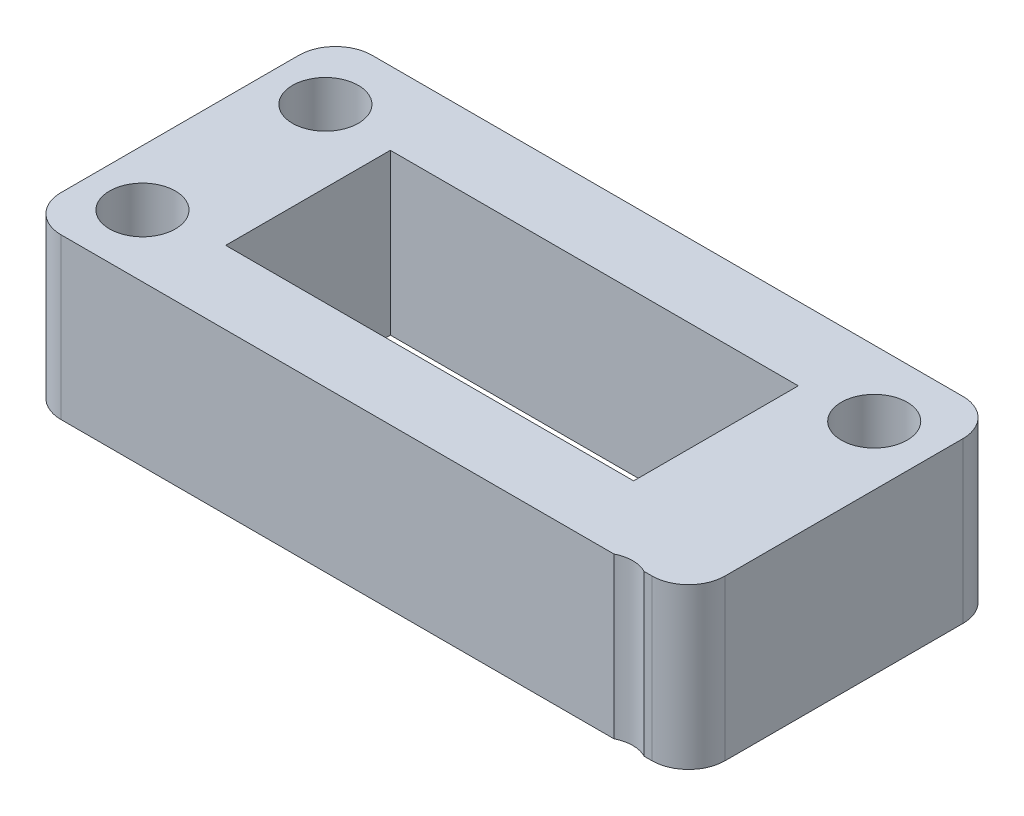
ISO-10303-21;
HEADER;
FILE_DESCRIPTION(('STEP AP214'),'2;1');
FILE_NAME('part.step','',(''),(''),'','','');
FILE_SCHEMA(('AUTOMOTIVE_DESIGN { 1 0 10303 214 1 1 1 1 }'));
ENDSEC;
DATA;
#1=APPLICATION_CONTEXT('core data for automotive mechanical design processes');
#2=APPLICATION_PROTOCOL_DEFINITION('international standard','automotive_design',2000,#1);
#3=PRODUCT_CONTEXT('',#1,'mechanical');
#4=PRODUCT('Part','Part','',(#3));
#5=PRODUCT_RELATED_PRODUCT_CATEGORY('part','',(#4));
#6=PRODUCT_DEFINITION_FORMATION('','',#4);
#7=PRODUCT_DEFINITION_CONTEXT('part definition',#1,'design');
#8=PRODUCT_DEFINITION('design','',#6,#7);
#9=PRODUCT_DEFINITION_SHAPE('','',#8);
#10=(LENGTH_UNIT() NAMED_UNIT(*) SI_UNIT(.MILLI.,.METRE.));
#11=(NAMED_UNIT(*) PLANE_ANGLE_UNIT() SI_UNIT($,.RADIAN.));
#12=(NAMED_UNIT(*) SI_UNIT($,.STERADIAN.) SOLID_ANGLE_UNIT());
#13=UNCERTAINTY_MEASURE_WITH_UNIT(LENGTH_MEASURE(1.E-05),#10,'distance_accuracy_value','');
#14=(GEOMETRIC_REPRESENTATION_CONTEXT(3) GLOBAL_UNCERTAINTY_ASSIGNED_CONTEXT((#13)) GLOBAL_UNIT_ASSIGNED_CONTEXT((#10,
#11,#12)) REPRESENTATION_CONTEXT('',''));
#15=CARTESIAN_POINT('',(0.,0.,0.));
#16=DIRECTION('',(0.,0.,1.));
#17=DIRECTION('',(1.,0.,0.));
#18=AXIS2_PLACEMENT_3D('',#15,#16,#17);
#19=CARTESIAN_POINT('',(0.,8.75,0.));
#20=DIRECTION('',(0.,0.,-1.));
#21=DIRECTION('',(-1.,0.,0.));
#22=AXIS2_PLACEMENT_3D('',#19,#20,#21);
#23=PLANE('',#22);
#24=DIRECTION('',(1.,0.,0.));
#25=VECTOR('',#24,1.);
#26=CARTESIAN_POINT('',(0.,8.75,0.));
#27=LINE('',#26,#25);
#28=CARTESIAN_POINT('',(2.,8.75,0.));
#29=VERTEX_POINT('',#28);
#30=CARTESIAN_POINT('',(32.2253838753308,8.75,0.));
#31=VERTEX_POINT('',#30);
#32=EDGE_CURVE('E220',#29,#31,#27,.T.);
#33=ORIENTED_EDGE('',*,*,#32,.F.);
#34=DIRECTION('',(0.,-1.,0.));
#35=VECTOR('',#34,1.);
#36=CARTESIAN_POINT('',(2.,8.75,0.));
#37=LINE('',#36,#35);
#38=CARTESIAN_POINT('',(2.,0.,0.));
#39=VERTEX_POINT('',#38);
#40=EDGE_CURVE('E11',#29,#39,#37,.T.);
#41=ORIENTED_EDGE('',*,*,#40,.T.);
#42=DIRECTION('',(1.,0.,0.));
#43=VECTOR('',#42,1.);
#44=CARTESIAN_POINT('',(0.,0.,0.));
#45=LINE('',#44,#43);
#46=CARTESIAN_POINT('',(32.2253838753308,0.,0.));
#47=VERTEX_POINT('',#46);
#48=EDGE_CURVE('E143',#39,#47,#45,.T.);
#49=ORIENTED_EDGE('',*,*,#48,.T.);
#50=DIRECTION('',(0.,1.,0.));
#51=VECTOR('',#50,1.);
#52=CARTESIAN_POINT('',(32.2253838753308,8.75,0.));
#53=LINE('',#52,#51);
#54=EDGE_CURVE('E145',#47,#31,#53,.T.);
#55=ORIENTED_EDGE('',*,*,#54,.T.);
#56=EDGE_LOOP('',(#33,#41,#49,#55));
#57=FACE_BOUND('',#56,.T.);
#58=ADVANCED_FACE('F39',(#57),#23,.F.);
#59=CARTESIAN_POINT('',(0.,8.75,0.));
#60=DIRECTION('',(0.,1.,0.));
#61=DIRECTION('',(0.,0.,1.));
#62=AXIS2_PLACEMENT_3D('',#59,#60,#61);
#63=PLANE('',#62);
#64=CARTESIAN_POINT('',(3.05000500045595,8.75,-3.39999999999836));
#65=DIRECTION('',(0.,1.,0.));
#66=DIRECTION('',(0.,0.,1.));
#67=AXIS2_PLACEMENT_3D('',#64,#65,#66);
#68=CIRCLE('',#67,1.79999999999999);
#69=CARTESIAN_POINT('',(3.05000500045595,8.75,-1.59999999999837));
#70=VERTEX_POINT('',#69);
#71=EDGE_CURVE('E480',#70,#70,#68,.T.);
#72=ORIENTED_EDGE('',*,*,#71,.F.);
#73=EDGE_LOOP('',(#72));
#74=FACE_BOUND('',#73,.T.);
#75=DIRECTION('',(-1.,0.,0.));
#76=VECTOR('',#75,1.);
#77=CARTESIAN_POINT('',(36.3,8.75,-17.));
#78=LINE('',#77,#76);
#79=CARTESIAN_POINT('',(34.3,8.75,-17.));
#80=VERTEX_POINT('',#79);
#81=CARTESIAN_POINT('',(2.,8.75,-17.));
#82=VERTEX_POINT('',#81);
#83=EDGE_CURVE('E224',#80,#82,#78,.T.);
#84=ORIENTED_EDGE('',*,*,#83,.T.);
#85=CARTESIAN_POINT('',(2.,8.75,-15.));
#86=DIRECTION('',(0.,1.,0.));
#87=DIRECTION('',(0.,0.,1.));
#88=AXIS2_PLACEMENT_3D('',#85,#86,#87);
#89=CIRCLE('',#88,2.);
#90=CARTESIAN_POINT('',(0.,8.75,-15.));
#91=VERTEX_POINT('',#90);
#92=EDGE_CURVE('E255',#82,#91,#89,.T.);
#93=ORIENTED_EDGE('',*,*,#92,.T.);
#94=DIRECTION('',(0.,0.,1.));
#95=VECTOR('',#94,1.);
#96=CARTESIAN_POINT('',(0.,8.75,-17.));
#97=LINE('',#96,#95);
#98=CARTESIAN_POINT('',(0.,8.75,-2.));
#99=VERTEX_POINT('',#98);
#100=EDGE_CURVE('E216',#91,#99,#97,.T.);
#101=ORIENTED_EDGE('',*,*,#100,.T.);
#102=CARTESIAN_POINT('',(2.,8.75,-2.));
#103=DIRECTION('',(0.,1.,0.));
#104=DIRECTION('',(0.,0.,1.));
#105=AXIS2_PLACEMENT_3D('',#102,#103,#104);
#106=CIRCLE('',#105,2.);
#107=EDGE_CURVE('E54',#99,#29,#106,.T.);
#108=ORIENTED_EDGE('',*,*,#107,.T.);
#109=ORIENTED_EDGE('',*,*,#32,.T.);
#110=CARTESIAN_POINT('',(33.0500050004553,8.75,1.59999999999948));
#111=DIRECTION('',(0.,1.,0.));
#112=DIRECTION('',(0.,0.,1.));
#113=AXIS2_PLACEMENT_3D('',#110,#111,#112);
#114=CIRCLE('',#113,1.79999999999999);
#115=CARTESIAN_POINT('',(33.8746261255798,8.75,0.));
#116=VERTEX_POINT('',#115);
#117=EDGE_CURVE('E158',#116,#31,#114,.T.);
#118=ORIENTED_EDGE('',*,*,#117,.F.);
#119=CARTESIAN_POINT('',(34.3,8.75,0.));
#120=VERTEX_POINT('',#119);
#121=EDGE_CURVE('E218',#116,#120,#27,.T.);
#122=ORIENTED_EDGE('',*,*,#121,.T.);
#123=CARTESIAN_POINT('',(34.3,8.75,-2.));
#124=DIRECTION('',(0.,1.,0.));
#125=DIRECTION('',(0.,0.,1.));
#126=AXIS2_PLACEMENT_3D('',#123,#124,#125);
#127=CIRCLE('',#126,2.);
#128=CARTESIAN_POINT('',(36.3,8.75,-2.));
#129=VERTEX_POINT('',#128);
#130=EDGE_CURVE('E251',#120,#129,#127,.T.);
#131=ORIENTED_EDGE('',*,*,#130,.T.);
#132=DIRECTION('',(0.,0.,-1.));
#133=VECTOR('',#132,1.);
#134=CARTESIAN_POINT('',(36.3,8.75,0.));
#135=LINE('',#134,#133);
#136=CARTESIAN_POINT('',(36.3,8.75,-15.));
#137=VERTEX_POINT('',#136);
#138=EDGE_CURVE('E222',#129,#137,#135,.T.);
#139=ORIENTED_EDGE('',*,*,#138,.T.);
#140=CARTESIAN_POINT('',(34.3,8.75,-15.));
#141=DIRECTION('',(0.,1.,0.));
#142=DIRECTION('',(0.,0.,1.));
#143=AXIS2_PLACEMENT_3D('',#140,#141,#142);
#144=CIRCLE('',#143,2.);
#145=EDGE_CURVE('E253',#137,#80,#144,.T.);
#146=ORIENTED_EDGE('',*,*,#145,.T.);
#147=EDGE_LOOP('',(#84,#93,#101,#108,#109,#118,#122,#131,#139,#146));
#148=FACE_BOUND('',#147,.T.);
#149=CARTESIAN_POINT('',(33.0500050004567,8.75,-13.3999999999987));
#150=DIRECTION('',(0.,1.,0.));
#151=DIRECTION('',(0.,0.,1.));
#152=AXIS2_PLACEMENT_3D('',#149,#150,#151);
#153=CIRCLE('',#152,1.79999999999999);
#154=CARTESIAN_POINT('',(33.0500050004567,8.75,-11.5999999999987));
#155=VERTEX_POINT('',#154);
#156=EDGE_CURVE('E167',#155,#155,#153,.T.);
#157=ORIENTED_EDGE('',*,*,#156,.F.);
#158=EDGE_LOOP('',(#157));
#159=FACE_BOUND('',#158,.T.);
#160=CARTESIAN_POINT('',(3.05000500045666,8.75,-13.3999999999988));
#161=DIRECTION('',(0.,1.,0.));
#162=DIRECTION('',(0.,0.,1.));
#163=AXIS2_PLACEMENT_3D('',#160,#161,#162);
#164=CIRCLE('',#163,1.79999999999999);
#165=CARTESIAN_POINT('',(3.05000500045666,8.75,-11.5999999999988));
#166=VERTEX_POINT('',#165);
#167=EDGE_CURVE('E178',#166,#166,#164,.T.);
#168=ORIENTED_EDGE('',*,*,#167,.F.);
#169=EDGE_LOOP('',(#168));
#170=FACE_BOUND('',#169,.T.);
#171=DIRECTION('',(0.,0.,1.));
#172=VECTOR('',#171,1.);
#173=CARTESIAN_POINT('',(7.,8.75,-13.));
#174=LINE('',#173,#172);
#175=CARTESIAN_POINT('',(7.,8.75,-13.));
#176=VERTEX_POINT('',#175);
#177=CARTESIAN_POINT('',(7.,8.75,-4.));
#178=VERTEX_POINT('',#177);
#179=EDGE_CURVE('E187',#176,#178,#174,.T.);
#180=ORIENTED_EDGE('',*,*,#179,.F.);
#181=DIRECTION('',(-1.,0.,0.));
#182=VECTOR('',#181,1.);
#183=CARTESIAN_POINT('',(29.3,8.75,-13.));
#184=LINE('',#183,#182);
#185=CARTESIAN_POINT('',(29.3,8.75,-13.));
#186=VERTEX_POINT('',#185);
#187=EDGE_CURVE('E185',#186,#176,#184,.T.);
#188=ORIENTED_EDGE('',*,*,#187,.F.);
#189=DIRECTION('',(0.,0.,-1.));
#190=VECTOR('',#189,1.);
#191=CARTESIAN_POINT('',(29.3,8.75,-4.));
#192=LINE('',#191,#190);
#193=CARTESIAN_POINT('',(29.3,8.75,-4.));
#194=VERTEX_POINT('',#193);
#195=EDGE_CURVE('E193',#194,#186,#192,.T.);
#196=ORIENTED_EDGE('',*,*,#195,.F.);
#197=DIRECTION('',(1.,0.,0.));
#198=VECTOR('',#197,1.);
#199=CARTESIAN_POINT('',(7.,8.75,-4.));
#200=LINE('',#199,#198);
#201=EDGE_CURVE('E190',#178,#194,#200,.T.);
#202=ORIENTED_EDGE('',*,*,#201,.F.);
#203=EDGE_LOOP('',(#180,#188,#196,#202));
#204=FACE_BOUND('',#203,.T.);
#205=ADVANCED_FACE('F267',(#74,#148,#159,#170,#204),#63,.T.);
#206=CARTESIAN_POINT('',(0.,0.,0.));
#207=DIRECTION('',(0.,1.,0.));
#208=DIRECTION('',(0.,0.,1.));
#209=AXIS2_PLACEMENT_3D('',#206,#207,#208);
#210=PLANE('',#209);
#211=CARTESIAN_POINT('',(3.05000500045595,0.,-3.39999999999836));
#212=DIRECTION('',(0.,1.,0.));
#213=DIRECTION('',(0.,0.,1.));
#214=AXIS2_PLACEMENT_3D('',#211,#212,#213);
#215=CIRCLE('',#214,1.8);
#216=CARTESIAN_POINT('',(3.05000500045595,0.,-1.59999999999836));
#217=VERTEX_POINT('',#216);
#218=EDGE_CURVE('E172',#217,#217,#215,.T.);
#219=ORIENTED_EDGE('',*,*,#218,.T.);
#220=EDGE_LOOP('',(#219));
#221=FACE_BOUND('',#220,.T.);
#222=CARTESIAN_POINT('',(33.0500050004567,0.,-13.3999999999987));
#223=DIRECTION('',(0.,1.,0.));
#224=DIRECTION('',(0.,0.,1.));
#225=AXIS2_PLACEMENT_3D('',#222,#223,#224);
#226=CIRCLE('',#225,1.8);
#227=CARTESIAN_POINT('',(33.0500050004567,0.,-11.5999999999987));
#228=VERTEX_POINT('',#227);
#229=EDGE_CURVE('E170',#228,#228,#226,.T.);
#230=ORIENTED_EDGE('',*,*,#229,.T.);
#231=EDGE_LOOP('',(#230));
#232=FACE_BOUND('',#231,.T.);
#233=CARTESIAN_POINT('',(3.05000500045666,0.,-13.3999999999988));
#234=DIRECTION('',(0.,1.,0.));
#235=DIRECTION('',(0.,0.,1.));
#236=AXIS2_PLACEMENT_3D('',#233,#234,#235);
#237=CIRCLE('',#236,1.8);
#238=CARTESIAN_POINT('',(3.05000500045666,0.,-11.5999999999988));
#239=VERTEX_POINT('',#238);
#240=EDGE_CURVE('E181',#239,#239,#237,.T.);
#241=ORIENTED_EDGE('',*,*,#240,.T.);
#242=EDGE_LOOP('',(#241));
#243=FACE_BOUND('',#242,.T.);
#244=DIRECTION('',(0.,0.,1.));
#245=VECTOR('',#244,1.);
#246=CARTESIAN_POINT('',(0.,0.,-17.));
#247=LINE('',#246,#245);
#248=CARTESIAN_POINT('',(0.,0.,-15.));
#249=VERTEX_POINT('',#248);
#250=CARTESIAN_POINT('',(0.,0.,-2.));
#251=VERTEX_POINT('',#250);
#252=EDGE_CURVE('E215',#249,#251,#247,.T.);
#253=ORIENTED_EDGE('',*,*,#252,.F.);
#254=CARTESIAN_POINT('',(2.,0.,-15.));
#255=DIRECTION('',(0.,1.,0.));
#256=DIRECTION('',(0.,0.,1.));
#257=AXIS2_PLACEMENT_3D('',#254,#255,#256);
#258=CIRCLE('',#257,2.);
#259=CARTESIAN_POINT('',(2.,0.,-17.));
#260=VERTEX_POINT('',#259);
#261=EDGE_CURVE('E243',#249,#260,#258,.F.);
#262=ORIENTED_EDGE('',*,*,#261,.T.);
#263=DIRECTION('',(-1.,0.,0.));
#264=VECTOR('',#263,1.);
#265=CARTESIAN_POINT('',(36.3,0.,-17.));
#266=LINE('',#265,#264);
#267=CARTESIAN_POINT('',(34.3,0.,-17.));
#268=VERTEX_POINT('',#267);
#269=EDGE_CURVE('E219',#268,#260,#266,.T.);
#270=ORIENTED_EDGE('',*,*,#269,.F.);
#271=CARTESIAN_POINT('',(34.3,0.,-15.));
#272=DIRECTION('',(0.,1.,0.));
#273=DIRECTION('',(0.,0.,1.));
#274=AXIS2_PLACEMENT_3D('',#271,#272,#273);
#275=CIRCLE('',#274,2.);
#276=CARTESIAN_POINT('',(36.3,0.,-15.));
#277=VERTEX_POINT('',#276);
#278=EDGE_CURVE('E241',#268,#277,#275,.F.);
#279=ORIENTED_EDGE('',*,*,#278,.T.);
#280=DIRECTION('',(0.,0.,-1.));
#281=VECTOR('',#280,1.);
#282=CARTESIAN_POINT('',(36.3,0.,0.));
#283=LINE('',#282,#281);
#284=CARTESIAN_POINT('',(36.3,0.,-2.));
#285=VERTEX_POINT('',#284);
#286=EDGE_CURVE('E149',#285,#277,#283,.T.);
#287=ORIENTED_EDGE('',*,*,#286,.F.);
#288=CARTESIAN_POINT('',(34.3,0.,-2.));
#289=DIRECTION('',(0.,1.,0.));
#290=DIRECTION('',(0.,0.,1.));
#291=AXIS2_PLACEMENT_3D('',#288,#289,#290);
#292=CIRCLE('',#291,2.);
#293=CARTESIAN_POINT('',(34.3,0.,0.));
#294=VERTEX_POINT('',#293);
#295=EDGE_CURVE('E239',#285,#294,#292,.F.);
#296=ORIENTED_EDGE('',*,*,#295,.T.);
#297=CARTESIAN_POINT('',(33.8746261255798,0.,0.));
#298=VERTEX_POINT('',#297);
#299=EDGE_CURVE('E150',#298,#294,#45,.T.);
#300=ORIENTED_EDGE('',*,*,#299,.F.);
#301=CARTESIAN_POINT('',(33.0500050004553,0.,1.59999999999948));
#302=DIRECTION('',(0.,1.,0.));
#303=DIRECTION('',(0.,0.,1.));
#304=AXIS2_PLACEMENT_3D('',#301,#302,#303);
#305=CIRCLE('',#304,1.8);
#306=EDGE_CURVE('E155',#298,#47,#305,.T.);
#307=ORIENTED_EDGE('',*,*,#306,.T.);
#308=ORIENTED_EDGE('',*,*,#48,.F.);
#309=CARTESIAN_POINT('',(2.,0.,-2.));
#310=DIRECTION('',(0.,1.,0.));
#311=DIRECTION('',(0.,0.,1.));
#312=AXIS2_PLACEMENT_3D('',#309,#310,#311);
#313=CIRCLE('',#312,2.);
#314=EDGE_CURVE('E237',#39,#251,#313,.F.);
#315=ORIENTED_EDGE('',*,*,#314,.T.);
#316=EDGE_LOOP('',(#253,#262,#270,#279,#287,#296,#300,#307,#308,#315));
#317=FACE_BOUND('',#316,.T.);
#318=DIRECTION('',(-1.,0.,0.));
#319=VECTOR('',#318,1.);
#320=CARTESIAN_POINT('',(29.3,0.,-13.));
#321=LINE('',#320,#319);
#322=CARTESIAN_POINT('',(29.3,0.,-13.));
#323=VERTEX_POINT('',#322);
#324=CARTESIAN_POINT('',(7.,0.,-13.));
#325=VERTEX_POINT('',#324);
#326=EDGE_CURVE('E184',#323,#325,#321,.T.);
#327=ORIENTED_EDGE('',*,*,#326,.T.);
#328=DIRECTION('',(0.,0.,1.));
#329=VECTOR('',#328,1.);
#330=CARTESIAN_POINT('',(7.,0.,-13.));
#331=LINE('',#330,#329);
#332=CARTESIAN_POINT('',(7.,0.,-4.));
#333=VERTEX_POINT('',#332);
#334=EDGE_CURVE('E198',#325,#333,#331,.T.);
#335=ORIENTED_EDGE('',*,*,#334,.T.);
#336=DIRECTION('',(1.,0.,0.));
#337=VECTOR('',#336,1.);
#338=CARTESIAN_POINT('',(7.,0.,-4.));
#339=LINE('',#338,#337);
#340=CARTESIAN_POINT('',(29.3,0.,-4.));
#341=VERTEX_POINT('',#340);
#342=EDGE_CURVE('E201',#333,#341,#339,.T.);
#343=ORIENTED_EDGE('',*,*,#342,.T.);
#344=DIRECTION('',(0.,0.,-1.));
#345=VECTOR('',#344,1.);
#346=CARTESIAN_POINT('',(29.3,0.,-4.));
#347=LINE('',#346,#345);
#348=EDGE_CURVE('E188',#341,#323,#347,.T.);
#349=ORIENTED_EDGE('',*,*,#348,.T.);
#350=EDGE_LOOP('',(#327,#335,#343,#349));
#351=FACE_BOUND('',#350,.T.);
#352=ADVANCED_FACE('F164',(#221,#232,#243,#317,#351),#210,.F.);
#353=CARTESIAN_POINT('',(0.,8.75,-17.));
#354=DIRECTION('',(1.,0.,0.));
#355=DIRECTION('',(0.,0.,-1.));
#356=AXIS2_PLACEMENT_3D('',#353,#354,#355);
#357=PLANE('',#356);
#358=ORIENTED_EDGE('',*,*,#100,.F.);
#359=DIRECTION('',(0.,-1.,0.));
#360=VECTOR('',#359,1.);
#361=CARTESIAN_POINT('',(0.,8.75,-15.));
#362=LINE('',#361,#360);
#363=EDGE_CURVE('E234',#91,#249,#362,.T.);
#364=ORIENTED_EDGE('',*,*,#363,.T.);
#365=ORIENTED_EDGE('',*,*,#252,.T.);
#366=DIRECTION('',(0.,-1.,0.));
#367=VECTOR('',#366,1.);
#368=CARTESIAN_POINT('',(0.,8.75,-2.));
#369=LINE('',#368,#367);
#370=EDGE_CURVE('E159',#251,#99,#369,.F.);
#371=ORIENTED_EDGE('',*,*,#370,.T.);
#372=EDGE_LOOP('',(#358,#364,#365,#371));
#373=FACE_BOUND('',#372,.T.);
#374=ADVANCED_FACE('F288',(#373),#357,.F.);
#375=ORIENTED_EDGE('',*,*,#299,.T.);
#376=DIRECTION('',(0.,-1.,0.));
#377=VECTOR('',#376,1.);
#378=CARTESIAN_POINT('',(34.3,8.75,0.));
#379=LINE('',#378,#377);
#380=EDGE_CURVE('E47',#294,#120,#379,.F.);
#381=ORIENTED_EDGE('',*,*,#380,.T.);
#382=ORIENTED_EDGE('',*,*,#121,.F.);
#383=DIRECTION('',(0.,1.,0.));
#384=VECTOR('',#383,1.);
#385=CARTESIAN_POINT('',(33.8746261255798,8.75,0.));
#386=LINE('',#385,#384);
#387=EDGE_CURVE('E160',#116,#298,#386,.F.);
#388=ORIENTED_EDGE('',*,*,#387,.T.);
#389=EDGE_LOOP('',(#375,#381,#382,#388));
#390=FACE_BOUND('',#389,.T.);
#391=ADVANCED_FACE('F264',(#390),#23,.F.);
#392=CARTESIAN_POINT('',(36.3,8.75,0.));
#393=DIRECTION('',(-1.,0.,0.));
#394=DIRECTION('',(0.,0.,1.));
#395=AXIS2_PLACEMENT_3D('',#392,#393,#394);
#396=PLANE('',#395);
#397=ORIENTED_EDGE('',*,*,#286,.T.);
#398=DIRECTION('',(0.,-1.,0.));
#399=VECTOR('',#398,1.);
#400=CARTESIAN_POINT('',(36.3,8.75,-15.));
#401=LINE('',#400,#399);
#402=EDGE_CURVE('E62',#277,#137,#401,.F.);
#403=ORIENTED_EDGE('',*,*,#402,.T.);
#404=ORIENTED_EDGE('',*,*,#138,.F.);
#405=DIRECTION('',(0.,-1.,0.));
#406=VECTOR('',#405,1.);
#407=CARTESIAN_POINT('',(36.3,8.75,-2.));
#408=LINE('',#407,#406);
#409=EDGE_CURVE('E257',#129,#285,#408,.T.);
#410=ORIENTED_EDGE('',*,*,#409,.T.);
#411=EDGE_LOOP('',(#397,#403,#404,#410));
#412=FACE_BOUND('',#411,.T.);
#413=ADVANCED_FACE('F272',(#412),#396,.F.);
#414=CARTESIAN_POINT('',(36.3,8.75,-17.));
#415=DIRECTION('',(0.,0.,1.));
#416=DIRECTION('',(1.,0.,0.));
#417=AXIS2_PLACEMENT_3D('',#414,#415,#416);
#418=PLANE('',#417);
#419=ORIENTED_EDGE('',*,*,#269,.T.);
#420=DIRECTION('',(0.,-1.,0.));
#421=VECTOR('',#420,1.);
#422=CARTESIAN_POINT('',(2.,8.75,-17.));
#423=LINE('',#422,#421);
#424=EDGE_CURVE('E248',#260,#82,#423,.F.);
#425=ORIENTED_EDGE('',*,*,#424,.T.);
#426=ORIENTED_EDGE('',*,*,#83,.F.);
#427=DIRECTION('',(0.,-1.,0.));
#428=VECTOR('',#427,1.);
#429=CARTESIAN_POINT('',(34.3,8.75,-17.));
#430=LINE('',#429,#428);
#431=EDGE_CURVE('E245',#80,#268,#430,.T.);
#432=ORIENTED_EDGE('',*,*,#431,.T.);
#433=EDGE_LOOP('',(#419,#425,#426,#432));
#434=FACE_BOUND('',#433,.T.);
#435=ADVANCED_FACE('F280',(#434),#418,.F.);
#436=CARTESIAN_POINT('',(29.3,8.75,-13.));
#437=DIRECTION('',(0.,0.,1.));
#438=DIRECTION('',(1.,0.,0.));
#439=AXIS2_PLACEMENT_3D('',#436,#437,#438);
#440=PLANE('',#439);
#441=ORIENTED_EDGE('',*,*,#326,.F.);
#442=DIRECTION('',(0.,-1.,0.));
#443=VECTOR('',#442,1.);
#444=CARTESIAN_POINT('',(29.3,8.75,-13.));
#445=LINE('',#444,#443);
#446=EDGE_CURVE('E195',#186,#323,#445,.T.);
#447=ORIENTED_EDGE('',*,*,#446,.F.);
#448=ORIENTED_EDGE('',*,*,#187,.T.);
#449=DIRECTION('',(0.,-1.,0.));
#450=VECTOR('',#449,1.);
#451=CARTESIAN_POINT('',(7.,8.75,-13.));
#452=LINE('',#451,#450);
#453=EDGE_CURVE('E212',#176,#325,#452,.T.);
#454=ORIENTED_EDGE('',*,*,#453,.T.);
#455=EDGE_LOOP('',(#441,#447,#448,#454));
#456=FACE_BOUND('',#455,.T.);
#457=ADVANCED_FACE('F403',(#456),#440,.T.);
#458=CARTESIAN_POINT('',(7.,8.75,-13.));
#459=DIRECTION('',(1.,0.,0.));
#460=DIRECTION('',(0.,0.,-1.));
#461=AXIS2_PLACEMENT_3D('',#458,#459,#460);
#462=PLANE('',#461);
#463=ORIENTED_EDGE('',*,*,#334,.F.);
#464=ORIENTED_EDGE('',*,*,#453,.F.);
#465=ORIENTED_EDGE('',*,*,#179,.T.);
#466=DIRECTION('',(0.,-1.,0.));
#467=VECTOR('',#466,1.);
#468=CARTESIAN_POINT('',(7.,8.75,-4.));
#469=LINE('',#468,#467);
#470=EDGE_CURVE('E210',#178,#333,#469,.T.);
#471=ORIENTED_EDGE('',*,*,#470,.T.);
#472=EDGE_LOOP('',(#463,#464,#465,#471));
#473=FACE_BOUND('',#472,.T.);
#474=ADVANCED_FACE('F394',(#473),#462,.T.);
#475=CARTESIAN_POINT('',(7.,8.75,-4.));
#476=DIRECTION('',(0.,0.,-1.));
#477=DIRECTION('',(-1.,0.,0.));
#478=AXIS2_PLACEMENT_3D('',#475,#476,#477);
#479=PLANE('',#478);
#480=ORIENTED_EDGE('',*,*,#342,.F.);
#481=ORIENTED_EDGE('',*,*,#470,.F.);
#482=ORIENTED_EDGE('',*,*,#201,.T.);
#483=DIRECTION('',(0.,-1.,0.));
#484=VECTOR('',#483,1.);
#485=CARTESIAN_POINT('',(29.3,8.75,-4.));
#486=LINE('',#485,#484);
#487=EDGE_CURVE('E208',#194,#341,#486,.T.);
#488=ORIENTED_EDGE('',*,*,#487,.T.);
#489=EDGE_LOOP('',(#480,#481,#482,#488));
#490=FACE_BOUND('',#489,.T.);
#491=ADVANCED_FACE('F385',(#490),#479,.T.);
#492=CARTESIAN_POINT('',(29.3,8.75,-4.));
#493=DIRECTION('',(-1.,0.,0.));
#494=DIRECTION('',(0.,0.,1.));
#495=AXIS2_PLACEMENT_3D('',#492,#493,#494);
#496=PLANE('',#495);
#497=ORIENTED_EDGE('',*,*,#348,.F.);
#498=ORIENTED_EDGE('',*,*,#487,.F.);
#499=ORIENTED_EDGE('',*,*,#195,.T.);
#500=ORIENTED_EDGE('',*,*,#446,.T.);
#501=EDGE_LOOP('',(#497,#498,#499,#500));
#502=FACE_BOUND('',#501,.T.);
#503=ADVANCED_FACE('F371',(#502),#496,.T.);
#504=CARTESIAN_POINT('',(3.05000500045666,8.75,-13.3999999999988));
#505=DIRECTION('',(0.,1.,0.));
#506=DIRECTION('',(0.,0.,1.));
#507=AXIS2_PLACEMENT_3D('',#504,#505,#506);
#508=CYLINDRICAL_SURFACE('',#507,1.79999999999999);
#509=ORIENTED_EDGE('',*,*,#240,.F.);
#510=EDGE_LOOP('',(#509));
#511=FACE_BOUND('',#510,.T.);
#512=ORIENTED_EDGE('',*,*,#167,.T.);
#513=EDGE_LOOP('',(#512));
#514=FACE_BOUND('',#513,.T.);
#515=ADVANCED_FACE('F363',(#511,#514),#508,.F.);
#516=CARTESIAN_POINT('',(33.0500050004567,8.75,-13.3999999999987));
#517=DIRECTION('',(0.,1.,0.));
#518=DIRECTION('',(0.,0.,1.));
#519=AXIS2_PLACEMENT_3D('',#516,#517,#518);
#520=CYLINDRICAL_SURFACE('',#519,1.79999999999999);
#521=ORIENTED_EDGE('',*,*,#229,.F.);
#522=EDGE_LOOP('',(#521));
#523=FACE_BOUND('',#522,.T.);
#524=ORIENTED_EDGE('',*,*,#156,.T.);
#525=EDGE_LOOP('',(#524));
#526=FACE_BOUND('',#525,.T.);
#527=ADVANCED_FACE('F355',(#523,#526),#520,.F.);
#528=CARTESIAN_POINT('',(33.0500050004553,8.75,1.59999999999948));
#529=DIRECTION('',(0.,1.,0.));
#530=DIRECTION('',(0.,0.,1.));
#531=AXIS2_PLACEMENT_3D('',#528,#529,#530);
#532=CYLINDRICAL_SURFACE('',#531,1.79999999999999);
#533=ORIENTED_EDGE('',*,*,#306,.F.);
#534=ORIENTED_EDGE('',*,*,#387,.F.);
#535=ORIENTED_EDGE('',*,*,#117,.T.);
#536=ORIENTED_EDGE('',*,*,#54,.F.);
#537=EDGE_LOOP('',(#533,#534,#535,#536));
#538=FACE_BOUND('',#537,.T.);
#539=ADVANCED_FACE('F154',(#538),#532,.F.);
#540=CARTESIAN_POINT('',(3.05000500045595,8.75,-3.39999999999836));
#541=DIRECTION('',(0.,1.,0.));
#542=DIRECTION('',(0.,0.,1.));
#543=AXIS2_PLACEMENT_3D('',#540,#541,#542);
#544=CYLINDRICAL_SURFACE('',#543,1.79999999999999);
#545=ORIENTED_EDGE('',*,*,#218,.F.);
#546=EDGE_LOOP('',(#545));
#547=FACE_BOUND('',#546,.T.);
#548=ORIENTED_EDGE('',*,*,#71,.T.);
#549=EDGE_LOOP('',(#548));
#550=FACE_BOUND('',#549,.T.);
#551=ADVANCED_FACE('F318',(#547,#550),#544,.F.);
#552=CARTESIAN_POINT('',(2.,8.75,-15.));
#553=DIRECTION('',(0.,-1.,0.));
#554=DIRECTION('',(0.,0.,-1.));
#555=AXIS2_PLACEMENT_3D('',#552,#553,#554);
#556=CYLINDRICAL_SURFACE('',#555,2.);
#557=ORIENTED_EDGE('',*,*,#92,.F.);
#558=ORIENTED_EDGE('',*,*,#424,.F.);
#559=ORIENTED_EDGE('',*,*,#261,.F.);
#560=ORIENTED_EDGE('',*,*,#363,.F.);
#561=EDGE_LOOP('',(#557,#558,#559,#560));
#562=FACE_BOUND('',#561,.T.);
#563=ADVANCED_FACE('F286',(#562),#556,.T.);
#564=CARTESIAN_POINT('',(34.3,8.75,-15.));
#565=DIRECTION('',(0.,-1.,0.));
#566=DIRECTION('',(0.,0.,-1.));
#567=AXIS2_PLACEMENT_3D('',#564,#565,#566);
#568=CYLINDRICAL_SURFACE('',#567,2.);
#569=ORIENTED_EDGE('',*,*,#145,.F.);
#570=ORIENTED_EDGE('',*,*,#402,.F.);
#571=ORIENTED_EDGE('',*,*,#278,.F.);
#572=ORIENTED_EDGE('',*,*,#431,.F.);
#573=EDGE_LOOP('',(#569,#570,#571,#572));
#574=FACE_BOUND('',#573,.T.);
#575=ADVANCED_FACE('F277',(#574),#568,.T.);
#576=CARTESIAN_POINT('',(34.3,8.75,-2.));
#577=DIRECTION('',(0.,-1.,0.));
#578=DIRECTION('',(0.,0.,-1.));
#579=AXIS2_PLACEMENT_3D('',#576,#577,#578);
#580=CYLINDRICAL_SURFACE('',#579,2.);
#581=ORIENTED_EDGE('',*,*,#130,.F.);
#582=ORIENTED_EDGE('',*,*,#380,.F.);
#583=ORIENTED_EDGE('',*,*,#295,.F.);
#584=ORIENTED_EDGE('',*,*,#409,.F.);
#585=EDGE_LOOP('',(#581,#582,#583,#584));
#586=FACE_BOUND('',#585,.T.);
#587=ADVANCED_FACE('F270',(#586),#580,.T.);
#588=CARTESIAN_POINT('',(2.,8.75,-2.));
#589=DIRECTION('',(0.,-1.,0.));
#590=DIRECTION('',(0.,0.,-1.));
#591=AXIS2_PLACEMENT_3D('',#588,#589,#590);
#592=CYLINDRICAL_SURFACE('',#591,2.);
#593=ORIENTED_EDGE('',*,*,#107,.F.);
#594=ORIENTED_EDGE('',*,*,#370,.F.);
#595=ORIENTED_EDGE('',*,*,#314,.F.);
#596=ORIENTED_EDGE('',*,*,#40,.F.);
#597=EDGE_LOOP('',(#593,#594,#595,#596));
#598=FACE_BOUND('',#597,.T.);
#599=ADVANCED_FACE('F41',(#598),#592,.T.);
#600=CLOSED_SHELL('',(#58,#205,#352,#374,#391,#413,#435,#457,#474,#491,#503,#515,#527,#539,#551,
#563,#575,#587,#599));
#601=MANIFOLD_SOLID_BREP('B2',#600);
#602=ADVANCED_BREP_SHAPE_REPRESENTATION('',(#18,#601),#14);
#603=SHAPE_DEFINITION_REPRESENTATION(#9,#602);
ENDSEC;
END-ISO-10303-21;
